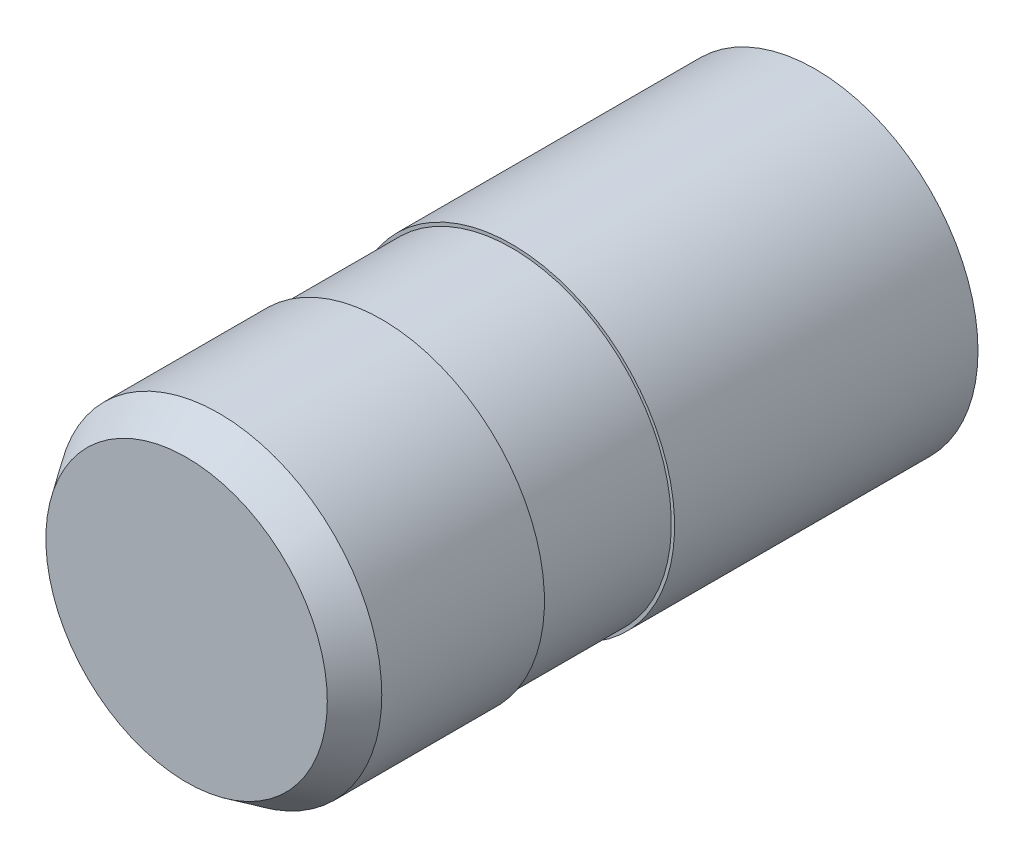
ISO-10303-21;
HEADER;
FILE_DESCRIPTION(('STEP AP214'),'2;1');
FILE_NAME('part.step','',(''),(''),'','','');
FILE_SCHEMA(('AUTOMOTIVE_DESIGN { 1 0 10303 214 1 1 1 1 }'));
ENDSEC;
DATA;
#1=APPLICATION_CONTEXT('core data for automotive mechanical design processes');
#2=APPLICATION_PROTOCOL_DEFINITION('international standard','automotive_design',2000,#1);
#3=PRODUCT_CONTEXT('',#1,'mechanical');
#4=PRODUCT('Part','Part','',(#3));
#5=PRODUCT_RELATED_PRODUCT_CATEGORY('part','',(#4));
#6=PRODUCT_DEFINITION_FORMATION('','',#4);
#7=PRODUCT_DEFINITION_CONTEXT('part definition',#1,'design');
#8=PRODUCT_DEFINITION('design','',#6,#7);
#9=PRODUCT_DEFINITION_SHAPE('','',#8);
#10=(LENGTH_UNIT() NAMED_UNIT(*) SI_UNIT(.MILLI.,.METRE.));
#11=(NAMED_UNIT(*) PLANE_ANGLE_UNIT() SI_UNIT($,.RADIAN.));
#12=(NAMED_UNIT(*) SI_UNIT($,.STERADIAN.) SOLID_ANGLE_UNIT());
#13=UNCERTAINTY_MEASURE_WITH_UNIT(LENGTH_MEASURE(1.E-05),#10,'distance_accuracy_value','');
#14=(GEOMETRIC_REPRESENTATION_CONTEXT(3) GLOBAL_UNCERTAINTY_ASSIGNED_CONTEXT((#13)) GLOBAL_UNIT_ASSIGNED_CONTEXT((#10,
#11,#12)) REPRESENTATION_CONTEXT('',''));
#15=CARTESIAN_POINT('',(0.,0.,0.));
#16=DIRECTION('',(0.,0.,1.));
#17=DIRECTION('',(1.,0.,0.));
#18=AXIS2_PLACEMENT_3D('',#15,#16,#17);
#19=CARTESIAN_POINT('',(0.,0.,50.));
#20=DIRECTION('',(0.,0.,-1.));
#21=DIRECTION('',(-1.,0.,0.));
#22=AXIS2_PLACEMENT_3D('',#19,#20,#21);
#23=CYLINDRICAL_SURFACE('',#22,25.);
#24=CARTESIAN_POINT('',(0.,0.,45.));
#25=DIRECTION('',(0.,0.,1.));
#26=DIRECTION('',(1.,0.,0.));
#27=AXIS2_PLACEMENT_3D('',#24,#25,#26);
#28=CIRCLE('',#27,25.);
#29=CARTESIAN_POINT('',(25.,0.,45.));
#30=VERTEX_POINT('',#29);
#31=EDGE_CURVE('E44',#30,#30,#28,.F.);
#32=ORIENTED_EDGE('',*,*,#31,.T.);
#33=EDGE_LOOP('',(#32));
#34=FACE_BOUND('',#33,.T.);
#35=CARTESIAN_POINT('',(0.,0.,20.));
#36=DIRECTION('',(0.,0.,-1.));
#37=DIRECTION('',(-1.,0.,0.));
#38=AXIS2_PLACEMENT_3D('',#35,#36,#37);
#39=CIRCLE('',#38,25.);
#40=CARTESIAN_POINT('',(-25.,0.,20.));
#41=VERTEX_POINT('',#40);
#42=EDGE_CURVE('E57',#41,#41,#39,.T.);
#43=ORIENTED_EDGE('',*,*,#42,.F.);
#44=EDGE_LOOP('',(#43));
#45=FACE_BOUND('',#44,.T.);
#46=ADVANCED_FACE('F36',(#34,#45),#23,.T.);
#47=CARTESIAN_POINT('',(0.,0.,50.));
#48=DIRECTION('',(0.,0.,1.));
#49=DIRECTION('',(1.,0.,0.));
#50=AXIS2_PLACEMENT_3D('',#47,#48,#49);
#51=PLANE('',#50);
#52=CARTESIAN_POINT('',(0.,0.,50.));
#53=DIRECTION('',(0.,0.,1.));
#54=DIRECTION('',(1.,0.,0.));
#55=AXIS2_PLACEMENT_3D('',#52,#53,#54);
#56=CIRCLE('',#55,21.6274574157879);
#57=CARTESIAN_POINT('',(21.6274574157879,0.,50.));
#58=VERTEX_POINT('',#57);
#59=EDGE_CURVE('E52',#58,#58,#56,.T.);
#60=ORIENTED_EDGE('',*,*,#59,.T.);
#61=EDGE_LOOP('',(#60));
#62=FACE_BOUND('',#61,.T.);
#63=ADVANCED_FACE('F82',(#62),#51,.T.);
#64=CARTESIAN_POINT('',(0.,0.,50.));
#65=DIRECTION('',(0.,0.,-1.));
#66=DIRECTION('',(-1.,0.,0.));
#67=AXIS2_PLACEMENT_3D('',#64,#65,#66);
#68=CONICAL_SURFACE('',#67,21.6274574157879,0.593411945678069);
#69=ORIENTED_EDGE('',*,*,#31,.F.);
#70=EDGE_LOOP('',(#69));
#71=FACE_BOUND('',#70,.T.);
#72=ORIENTED_EDGE('',*,*,#59,.F.);
#73=EDGE_LOOP('',(#72));
#74=FACE_BOUND('',#73,.T.);
#75=ADVANCED_FACE('F77',(#71,#74),#68,.T.);
#76=CARTESIAN_POINT('',(0.,0.,20.));
#77=DIRECTION('',(0.,0.,-1.));
#78=DIRECTION('',(-1.,0.,0.));
#79=AXIS2_PLACEMENT_3D('',#76,#77,#78);
#80=PLANE('',#79);
#81=CARTESIAN_POINT('',(0.,0.,20.));
#82=DIRECTION('',(0.,0.,-1.));
#83=DIRECTION('',(-1.,0.,0.));
#84=AXIS2_PLACEMENT_3D('',#81,#82,#83);
#85=CIRCLE('',#84,24.5);
#86=CARTESIAN_POINT('',(-24.5,0.,20.));
#87=VERTEX_POINT('',#86);
#88=EDGE_CURVE('E61',#87,#87,#85,.T.);
#89=ORIENTED_EDGE('',*,*,#88,.F.);
#90=EDGE_LOOP('',(#89));
#91=FACE_BOUND('',#90,.T.);
#92=ORIENTED_EDGE('',*,*,#42,.T.);
#93=EDGE_LOOP('',(#92));
#94=FACE_BOUND('',#93,.T.);
#95=ADVANCED_FACE('F73',(#91,#94),#80,.T.);
#96=CARTESIAN_POINT('',(0.,0.,0.));
#97=DIRECTION('',(0.,0.,-1.));
#98=DIRECTION('',(-1.,0.,0.));
#99=AXIS2_PLACEMENT_3D('',#96,#97,#98);
#100=PLANE('',#99);
#101=CARTESIAN_POINT('',(0.,0.,0.));
#102=DIRECTION('',(0.,0.,-1.));
#103=DIRECTION('',(-1.,0.,0.));
#104=AXIS2_PLACEMENT_3D('',#101,#102,#103);
#105=CIRCLE('',#104,24.5);
#106=CARTESIAN_POINT('',(-24.5,0.,0.));
#107=VERTEX_POINT('',#106);
#108=EDGE_CURVE('E64',#107,#107,#105,.T.);
#109=ORIENTED_EDGE('',*,*,#108,.T.);
#110=EDGE_LOOP('',(#109));
#111=FACE_BOUND('',#110,.T.);
#112=CARTESIAN_POINT('',(0.,0.,0.));
#113=DIRECTION('',(0.,0.,-1.));
#114=DIRECTION('',(-1.,0.,0.));
#115=AXIS2_PLACEMENT_3D('',#112,#113,#114);
#116=CIRCLE('',#115,25.);
#117=CARTESIAN_POINT('',(-25.,0.,0.));
#118=VERTEX_POINT('',#117);
#119=EDGE_CURVE('E58',#118,#118,#116,.T.);
#120=ORIENTED_EDGE('',*,*,#119,.F.);
#121=EDGE_LOOP('',(#120));
#122=FACE_BOUND('',#121,.T.);
#123=ADVANCED_FACE('F76',(#111,#122),#100,.F.);
#124=CARTESIAN_POINT('',(0.,0.,20.));
#125=DIRECTION('',(0.,0.,-1.));
#126=DIRECTION('',(-1.,0.,0.));
#127=AXIS2_PLACEMENT_3D('',#124,#125,#126);
#128=CYLINDRICAL_SURFACE('',#127,24.5);
#129=ORIENTED_EDGE('',*,*,#88,.T.);
#130=EDGE_LOOP('',(#129));
#131=FACE_BOUND('',#130,.T.);
#132=ORIENTED_EDGE('',*,*,#108,.F.);
#133=EDGE_LOOP('',(#132));
#134=FACE_BOUND('',#133,.T.);
#135=ADVANCED_FACE('F70',(#131,#134),#128,.T.);
#136=CARTESIAN_POINT('',(0.,0.,-50.));
#137=DIRECTION('',(0.,0.,1.));
#138=DIRECTION('',(1.,0.,0.));
#139=AXIS2_PLACEMENT_3D('',#136,#137,#138);
#140=PLANE('',#139);
#141=CARTESIAN_POINT('',(0.,0.,-50.));
#142=DIRECTION('',(0.,0.,1.));
#143=DIRECTION('',(1.,0.,0.));
#144=AXIS2_PLACEMENT_3D('',#141,#142,#143);
#145=CIRCLE('',#144,20.);
#146=CARTESIAN_POINT('',(20.,0.,-50.));
#147=VERTEX_POINT('',#146);
#148=EDGE_CURVE('E10',#147,#147,#145,.F.);
#149=ORIENTED_EDGE('',*,*,#148,.T.);
#150=EDGE_LOOP('',(#149));
#151=FACE_BOUND('',#150,.T.);
#152=ADVANCED_FACE('F96',(#151),#140,.F.);
#153=CARTESIAN_POINT('',(0.,0.,-46.6274574157879));
#154=DIRECTION('',(0.,0.,1.));
#155=DIRECTION('',(1.,0.,0.));
#156=AXIS2_PLACEMENT_3D('',#153,#154,#155);
#157=CONICAL_SURFACE('',#156,25.,0.977384381116825);
#158=ORIENTED_EDGE('',*,*,#148,.F.);
#159=EDGE_LOOP('',(#158));
#160=FACE_BOUND('',#159,.T.);
#161=CARTESIAN_POINT('',(0.,0.,-46.6274574157879));
#162=DIRECTION('',(0.,0.,1.));
#163=DIRECTION('',(1.,0.,0.));
#164=AXIS2_PLACEMENT_3D('',#161,#162,#163);
#165=CIRCLE('',#164,25.);
#166=CARTESIAN_POINT('',(25.,0.,-46.6274574157879));
#167=VERTEX_POINT('',#166);
#168=EDGE_CURVE('E48',#167,#167,#165,.T.);
#169=ORIENTED_EDGE('',*,*,#168,.F.);
#170=EDGE_LOOP('',(#169));
#171=FACE_BOUND('',#170,.T.);
#172=ADVANCED_FACE('F39',(#160,#171),#157,.T.);
#173=ORIENTED_EDGE('',*,*,#119,.T.);
#174=EDGE_LOOP('',(#173));
#175=FACE_BOUND('',#174,.T.);
#176=ORIENTED_EDGE('',*,*,#168,.T.);
#177=EDGE_LOOP('',(#176));
#178=FACE_BOUND('',#177,.T.);
#179=ADVANCED_FACE('F84',(#175,#178),#23,.T.);
#180=CLOSED_SHELL('',(#46,#63,#75,#95,#123,#135,#152,#172,#179));
#181=MANIFOLD_SOLID_BREP('B2',#180);
#182=ADVANCED_BREP_SHAPE_REPRESENTATION('',(#18,#181),#14);
#183=SHAPE_DEFINITION_REPRESENTATION(#9,#182);
ENDSEC;
END-ISO-10303-21;
